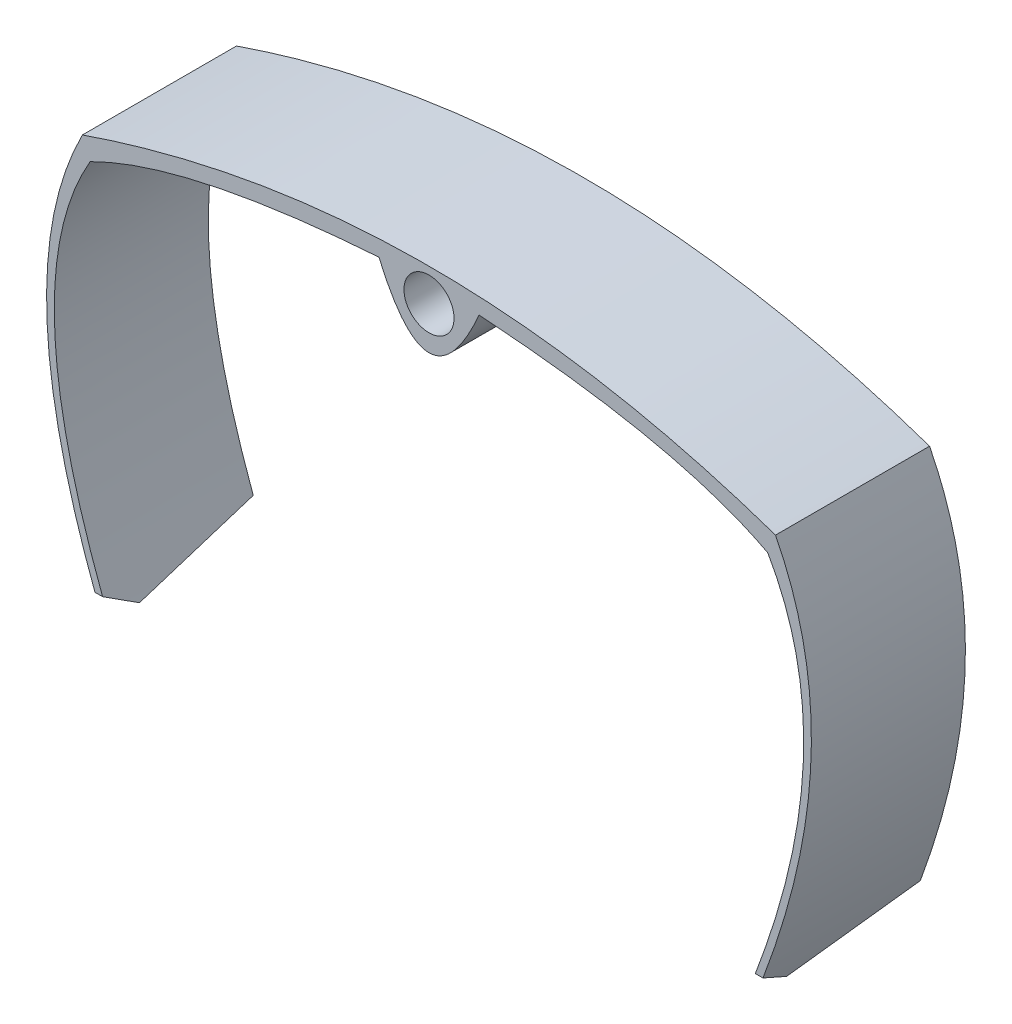
ISO-10303-21;
HEADER;
FILE_DESCRIPTION(('STEP AP214'),'2;1');
FILE_NAME('part.step','',(''),(''),'','','');
FILE_SCHEMA(('AUTOMOTIVE_DESIGN { 1 0 10303 214 1 1 1 1 }'));
ENDSEC;
DATA;
#1=APPLICATION_CONTEXT('core data for automotive mechanical design processes');
#2=APPLICATION_PROTOCOL_DEFINITION('international standard','automotive_design',2000,#1);
#3=PRODUCT_CONTEXT('',#1,'mechanical');
#4=PRODUCT('Part','Part','',(#3));
#5=PRODUCT_RELATED_PRODUCT_CATEGORY('part','',(#4));
#6=PRODUCT_DEFINITION_FORMATION('','',#4);
#7=PRODUCT_DEFINITION_CONTEXT('part definition',#1,'design');
#8=PRODUCT_DEFINITION('design','',#6,#7);
#9=PRODUCT_DEFINITION_SHAPE('','',#8);
#10=(LENGTH_UNIT() NAMED_UNIT(*) SI_UNIT(.MILLI.,.METRE.));
#11=(NAMED_UNIT(*) PLANE_ANGLE_UNIT() SI_UNIT($,.RADIAN.));
#12=(NAMED_UNIT(*) SI_UNIT($,.STERADIAN.) SOLID_ANGLE_UNIT());
#13=UNCERTAINTY_MEASURE_WITH_UNIT(LENGTH_MEASURE(1.E-05),#10,'distance_accuracy_value','');
#14=(GEOMETRIC_REPRESENTATION_CONTEXT(3) GLOBAL_UNCERTAINTY_ASSIGNED_CONTEXT((#13)) GLOBAL_UNIT_ASSIGNED_CONTEXT((#10,
#11,#12)) REPRESENTATION_CONTEXT('',''));
#15=CARTESIAN_POINT('',(0.,0.,0.));
#16=DIRECTION('',(0.,0.,1.));
#17=DIRECTION('',(1.,0.,0.));
#18=AXIS2_PLACEMENT_3D('',#15,#16,#17);
#19=CARTESIAN_POINT('',(-49.5,-28.375,20.));
#20=DIRECTION('',(0.,0.,-1.));
#21=DIRECTION('',(-1.,0.,0.));
#22=AXIS2_PLACEMENT_3D('',#19,#20,#21);
#23=PLANE('',#22);
#24=CARTESIAN_POINT('',(-45.,-3.5,20.));
#25=CARTESIAN_POINT('',(-56.,-25.,20.));
#26=CARTESIAN_POINT('',(-41.,-60.,20.));
#27=B_SPLINE_CURVE_WITH_KNOTS('',2,(#24,#25,#26),.UNSPECIFIED.,.F.,.F.,(3,3),(0.,1.),.UNSPECIFIED.);
#28=CARTESIAN_POINT('',(-45.,-3.5,20.));
#29=VERTEX_POINT('',#28);
#30=CARTESIAN_POINT('',(-43.3725551343736,-54.1199880788758,20.));
#31=VERTEX_POINT('',#30);
#32=EDGE_CURVE('E251',#29,#31,#27,.T.);
#33=ORIENTED_EDGE('',*,*,#32,.T.);
#34=DIRECTION('',(1.,0.,0.));
#35=VECTOR('',#34,1.);
#36=CARTESIAN_POINT('',(-49.5,-54.1199880788758,20.));
#37=LINE('',#36,#35);
#38=CARTESIAN_POINT('',(-42.3794825890074,-54.1199880857841,19.9999999976195));
#39=VERTEX_POINT('',#38);
#40=EDGE_CURVE('E136',#31,#39,#37,.T.);
#41=ORIENTED_EDGE('',*,*,#40,.T.);
#42=CARTESIAN_POINT('',(-40.,-60.,20.));
#43=CARTESIAN_POINT('',(-55.,-25.,20.));
#44=CARTESIAN_POINT('',(-44.,-6.,20.));
#45=B_SPLINE_CURVE_WITH_KNOTS('',2,(#42,#43,#44),.UNSPECIFIED.,.F.,.F.,(3,3),(0.,1.),.UNSPECIFIED.);
#46=CARTESIAN_POINT('',(-44.,-6.,20.));
#47=VERTEX_POINT('',#46);
#48=EDGE_CURVE('E269',#39,#47,#45,.T.);
#49=ORIENTED_EDGE('',*,*,#48,.T.);
#50=CARTESIAN_POINT('',(-44.,-6.,20.));
#51=CARTESIAN_POINT('',(-31.6079509094557,0.274777247759242,20.));
#52=CARTESIAN_POINT('',(-6.5,2.,20.));
#53=B_SPLINE_CURVE_WITH_KNOTS('',2,(#50,#51,#52),.UNSPECIFIED.,.F.,.F.,(3,3),(0.,1.),.UNSPECIFIED.);
#54=CARTESIAN_POINT('',(-6.5,2.,20.));
#55=VERTEX_POINT('',#54);
#56=EDGE_CURVE('E278',#47,#55,#53,.T.);
#57=ORIENTED_EDGE('',*,*,#56,.T.);
#58=CARTESIAN_POINT('',(-6.5,2.,20.));
#59=CARTESIAN_POINT('',(0.,-13.,20.));
#60=CARTESIAN_POINT('',(6.5,2.,20.));
#61=B_SPLINE_CURVE_WITH_KNOTS('',2,(#58,#59,#60),.UNSPECIFIED.,.F.,.F.,(3,3),(0.,1.),.UNSPECIFIED.);
#62=CARTESIAN_POINT('',(6.5,2.,20.));
#63=VERTEX_POINT('',#62);
#64=EDGE_CURVE('E312',#55,#63,#61,.T.);
#65=ORIENTED_EDGE('',*,*,#64,.T.);
#66=CARTESIAN_POINT('',(6.5,2.,20.));
#67=CARTESIAN_POINT('',(32.2286710129802,0.274777247759242,20.));
#68=CARTESIAN_POINT('',(44.,-6.,20.));
#69=B_SPLINE_CURVE_WITH_KNOTS('',2,(#66,#67,#68),.UNSPECIFIED.,.F.,.F.,(3,3),(0.,1.),.UNSPECIFIED.);
#70=CARTESIAN_POINT('',(44.,-6.,20.));
#71=VERTEX_POINT('',#70);
#72=EDGE_CURVE('E212',#63,#71,#69,.T.);
#73=ORIENTED_EDGE('',*,*,#72,.T.);
#74=CARTESIAN_POINT('',(44.,-6.,20.));
#75=CARTESIAN_POINT('',(55.,-25.,20.));
#76=CARTESIAN_POINT('',(40.,-60.,20.));
#77=B_SPLINE_CURVE_WITH_KNOTS('',2,(#74,#75,#76),.UNSPECIFIED.,.F.,.F.,(3,3),(0.,1.),.UNSPECIFIED.);
#78=CARTESIAN_POINT('',(42.3794825895538,-54.1199880788758,20.));
#79=VERTEX_POINT('',#78);
#80=EDGE_CURVE('E206',#71,#79,#77,.T.);
#81=ORIENTED_EDGE('',*,*,#80,.T.);
#82=CARTESIAN_POINT('',(43.3725551338298,-54.1199880858131,19.9999999976095));
#83=VERTEX_POINT('',#82);
#84=EDGE_CURVE('E152',#79,#83,#37,.T.);
#85=ORIENTED_EDGE('',*,*,#84,.T.);
#86=CARTESIAN_POINT('',(41.,-60.,20.));
#87=CARTESIAN_POINT('',(56.,-25.,20.));
#88=CARTESIAN_POINT('',(45.,-3.5,20.));
#89=B_SPLINE_CURVE_WITH_KNOTS('',2,(#86,#87,#88),.UNSPECIFIED.,.F.,.F.,(3,3),(0.,1.),.UNSPECIFIED.);
#90=CARTESIAN_POINT('',(45.,-3.5,20.));
#91=VERTEX_POINT('',#90);
#92=EDGE_CURVE('E211',#83,#91,#89,.T.);
#93=ORIENTED_EDGE('',*,*,#92,.T.);
#94=CARTESIAN_POINT('',(45.,-3.5,20.));
#95=CARTESIAN_POINT('',(0.,12.,20.));
#96=CARTESIAN_POINT('',(-45.,-3.5,20.));
#97=B_SPLINE_CURVE_WITH_KNOTS('',2,(#94,#95,#96),.UNSPECIFIED.,.F.,.F.,(3,3),(0.,1.),.UNSPECIFIED.);
#98=EDGE_CURVE('E224',#91,#29,#97,.T.);
#99=ORIENTED_EDGE('',*,*,#98,.T.);
#100=EDGE_LOOP('',(#33,#41,#49,#57,#65,#73,#81,#85,#93,#99));
#101=FACE_BOUND('',#100,.T.);
#102=CARTESIAN_POINT('',(0.,0.,20.));
#103=DIRECTION('',(0.,0.,1.));
#104=DIRECTION('',(1.,0.,0.));
#105=AXIS2_PLACEMENT_3D('',#102,#103,#104);
#106=CIRCLE('',#105,3.25);
#107=CARTESIAN_POINT('',(3.25,0.,20.));
#108=VERTEX_POINT('',#107);
#109=EDGE_CURVE('E254',#108,#108,#106,.T.);
#110=ORIENTED_EDGE('',*,*,#109,.F.);
#111=EDGE_LOOP('',(#110));
#112=FACE_BOUND('',#111,.T.);
#113=ADVANCED_FACE('F33',(#101,#112),#23,.F.);
#114=CARTESIAN_POINT('',(-49.5,-28.375,0.));
#115=DIRECTION('',(0.,0.,-1.));
#116=DIRECTION('',(-1.,0.,0.));
#117=AXIS2_PLACEMENT_3D('',#114,#115,#116);
#118=PLANE('',#117);
#119=DIRECTION('',(1.,0.,0.));
#120=VECTOR('',#119,1.);
#121=CARTESIAN_POINT('',(-49.5,-52.9458802962909,0.));
#122=LINE('',#121,#120);
#123=CARTESIAN_POINT('',(-43.8095242499858,-52.9458802962909,0.));
#124=VERTEX_POINT('',#123);
#125=CARTESIAN_POINT('',(-42.8192871205812,-52.9458802961712,0.));
#126=VERTEX_POINT('',#125);
#127=EDGE_CURVE('E56',#124,#126,#122,.T.);
#128=ORIENTED_EDGE('',*,*,#127,.F.);
#129=CARTESIAN_POINT('',(-45.,-3.5,0.));
#130=CARTESIAN_POINT('',(-56.,-25.,0.));
#131=CARTESIAN_POINT('',(-41.,-60.,0.));
#132=B_SPLINE_CURVE_WITH_KNOTS('',2,(#129,#130,#131),.UNSPECIFIED.,.F.,.F.,(3,3),(0.,1.),.UNSPECIFIED.);
#133=CARTESIAN_POINT('',(-45.,-3.5,0.));
#134=VERTEX_POINT('',#133);
#135=EDGE_CURVE('E151',#134,#124,#132,.T.);
#136=ORIENTED_EDGE('',*,*,#135,.F.);
#137=CARTESIAN_POINT('',(45.,-3.5,0.));
#138=CARTESIAN_POINT('',(0.,12.,0.));
#139=CARTESIAN_POINT('',(-45.,-3.5,0.));
#140=B_SPLINE_CURVE_WITH_KNOTS('',2,(#137,#138,#139),.UNSPECIFIED.,.F.,.F.,(3,3),(0.,1.),.UNSPECIFIED.);
#141=CARTESIAN_POINT('',(45.,-3.5,0.));
#142=VERTEX_POINT('',#141);
#143=EDGE_CURVE('E270',#142,#134,#140,.T.);
#144=ORIENTED_EDGE('',*,*,#143,.F.);
#145=CARTESIAN_POINT('',(41.,-60.,0.));
#146=CARTESIAN_POINT('',(56.,-25.,0.));
#147=CARTESIAN_POINT('',(45.,-3.5,0.));
#148=B_SPLINE_CURVE_WITH_KNOTS('',2,(#145,#146,#147),.UNSPECIFIED.,.F.,.F.,(3,3),(0.,1.),.UNSPECIFIED.);
#149=CARTESIAN_POINT('',(43.8095242514418,-52.9458803020215,0.));
#150=VERTEX_POINT('',#149);
#151=EDGE_CURVE('E339',#150,#142,#148,.T.);
#152=ORIENTED_EDGE('',*,*,#151,.F.);
#153=CARTESIAN_POINT('',(42.819287120613,-52.9458802962909,0.));
#154=VERTEX_POINT('',#153);
#155=EDGE_CURVE('E64',#154,#150,#122,.T.);
#156=ORIENTED_EDGE('',*,*,#155,.F.);
#157=CARTESIAN_POINT('',(44.,-6.,0.));
#158=CARTESIAN_POINT('',(55.,-25.,0.));
#159=CARTESIAN_POINT('',(40.,-60.,0.));
#160=B_SPLINE_CURVE_WITH_KNOTS('',2,(#157,#158,#159),.UNSPECIFIED.,.F.,.F.,(3,3),(0.,1.),.UNSPECIFIED.);
#161=CARTESIAN_POINT('',(44.,-6.,0.));
#162=VERTEX_POINT('',#161);
#163=EDGE_CURVE('E342',#162,#154,#160,.T.);
#164=ORIENTED_EDGE('',*,*,#163,.F.);
#165=CARTESIAN_POINT('',(6.5,2.,0.));
#166=CARTESIAN_POINT('',(32.2286710129802,0.274777247759242,0.));
#167=CARTESIAN_POINT('',(44.,-6.,0.));
#168=B_SPLINE_CURVE_WITH_KNOTS('',2,(#165,#166,#167),.UNSPECIFIED.,.F.,.F.,(3,3),(0.,1.),.UNSPECIFIED.);
#169=CARTESIAN_POINT('',(6.5,2.,0.));
#170=VERTEX_POINT('',#169);
#171=EDGE_CURVE('E318',#170,#162,#168,.T.);
#172=ORIENTED_EDGE('',*,*,#171,.F.);
#173=CARTESIAN_POINT('',(-6.5,2.,0.));
#174=CARTESIAN_POINT('',(0.,-13.,0.));
#175=CARTESIAN_POINT('',(6.5,2.,0.));
#176=B_SPLINE_CURVE_WITH_KNOTS('',2,(#173,#174,#175),.UNSPECIFIED.,.F.,.F.,(3,3),(0.,1.),.UNSPECIFIED.);
#177=CARTESIAN_POINT('',(-6.5,2.,0.));
#178=VERTEX_POINT('',#177);
#179=EDGE_CURVE('E364',#178,#170,#176,.T.);
#180=ORIENTED_EDGE('',*,*,#179,.F.);
#181=CARTESIAN_POINT('',(-44.,-6.,0.));
#182=CARTESIAN_POINT('',(-31.6079509094557,0.274777247759242,0.));
#183=CARTESIAN_POINT('',(-6.5,2.,0.));
#184=B_SPLINE_CURVE_WITH_KNOTS('',2,(#181,#182,#183),.UNSPECIFIED.,.F.,.F.,(3,3),(0.,1.),.UNSPECIFIED.);
#185=CARTESIAN_POINT('',(-44.,-6.,0.));
#186=VERTEX_POINT('',#185);
#187=EDGE_CURVE('E363',#186,#178,#184,.T.);
#188=ORIENTED_EDGE('',*,*,#187,.F.);
#189=CARTESIAN_POINT('',(-40.,-60.,0.));
#190=CARTESIAN_POINT('',(-55.,-25.,0.));
#191=CARTESIAN_POINT('',(-44.,-6.,0.));
#192=B_SPLINE_CURVE_WITH_KNOTS('',2,(#189,#190,#191),.UNSPECIFIED.,.F.,.F.,(3,3),(0.,1.),.UNSPECIFIED.);
#193=EDGE_CURVE('E257',#126,#186,#192,.T.);
#194=ORIENTED_EDGE('',*,*,#193,.F.);
#195=EDGE_LOOP('',(#128,#136,#144,#152,#156,#164,#172,#180,#188,#194));
#196=FACE_BOUND('',#195,.T.);
#197=CARTESIAN_POINT('',(0.,0.,0.));
#198=DIRECTION('',(0.,0.,1.));
#199=DIRECTION('',(1.,0.,0.));
#200=AXIS2_PLACEMENT_3D('',#197,#198,#199);
#201=CIRCLE('',#200,3.25);
#202=CARTESIAN_POINT('',(3.25,0.,0.));
#203=VERTEX_POINT('',#202);
#204=EDGE_CURVE('E141',#203,#203,#201,.T.);
#205=ORIENTED_EDGE('',*,*,#204,.T.);
#206=EDGE_LOOP('',(#205));
#207=FACE_BOUND('',#206,.T.);
#208=ADVANCED_FACE('F243',(#196,#207),#118,.T.);
#209=DIRECTION('',(0.,0.,-1.));
#210=VECTOR('',#209,1.);
#211=SURFACE_OF_LINEAR_EXTRUSION('',#27,#210);
#212=CARTESIAN_POINT('',(-43.8095242499074,-52.9458803014588,9.99641291632411E-10));
#213=CARTESIAN_POINT('',(-43.7405387966916,-53.1339845054756,0.893216633095755));
#214=CARTESIAN_POINT('',(-43.6710617853799,-53.3220810534,1.78639690118482));
#215=CARTESIAN_POINT('',(-43.5311348473555,-53.6982583665723,3.57268248515687));
#216=CARTESIAN_POINT('',(-43.4606849227849,-53.8863391318539,4.46578780120052));
#217=CARTESIAN_POINT('',(-43.3188221315729,-54.2624850349748,6.25192422816345));
#218=CARTESIAN_POINT('',(-43.247409265968,-54.4505501728306,7.14495533916158));
#219=CARTESIAN_POINT('',(-43.1036303511905,-54.8266649689923,8.93094405564118));
#220=CARTESIAN_POINT('',(-43.0312643020459,-55.0147146272986,9.82390166112483));
#221=CARTESIAN_POINT('',(-42.8855886297336,-55.3907986313318,11.609744160139));
#222=CARTESIAN_POINT('',(-42.8122790055225,-55.5788329770415,12.5026290535881));
#223=CARTESIAN_POINT('',(-42.6647255908599,-55.9548865129671,14.2883268743174));
#224=CARTESIAN_POINT('',(-42.590481798387,-56.1429057031494,15.1811398014378));
#225=CARTESIAN_POINT('',(-42.5157757451419,-56.3309170911311,16.0739156795812));
#226=B_SPLINE_CURVE_WITH_KNOTS('',3,(#212,#213,#214,#215,#216,#217,#218,#219,#220,#221,#222,
#223,#224,#225),.UNSPECIFIED.,.F.,.F.,(4,2,2,2,2,2,4),(0.,2.74623422202778,5.49246239872015,
8.23868761956475,10.9849127592141,13.7311409359048,16.4773750564232),.UNSPECIFIED.);
#227=CARTESIAN_POINT('',(-42.5157757451419,-56.3309170911311,16.0739156795812));
#228=VERTEX_POINT('',#227);
#229=EDGE_CURVE('E144',#124,#228,#226,.T.);
#230=ORIENTED_EDGE('',*,*,#229,.T.);
#231=CARTESIAN_POINT('',(-42.5157757451419,-56.3309170911311,16.0739156795812));
#232=CARTESIAN_POINT('',(-42.6620900863464,-55.9627571434735,16.7276802237581));
#233=CARTESIAN_POINT('',(-42.8066455395971,-55.5944330855392,17.3817361887725));
#234=CARTESIAN_POINT('',(-43.0922386701909,-54.8574567491169,18.6904309604766));
#235=CARTESIAN_POINT('',(-43.2332763475341,-54.4888044706289,19.3450697671662));
#236=CARTESIAN_POINT('',(-43.3725551369235,-54.1199880818642,19.9999999946934));
#237=B_SPLINE_CURVE_WITH_KNOTS('',3,(#231,#232,#233,#234,#235,#236),.UNSPECIFIED.,.F.,.F.,(4,2,
4),(0.,2.29327993598656,4.58655987197313),.UNSPECIFIED.);
#238=EDGE_CURVE('E130',#228,#31,#237,.T.);
#239=ORIENTED_EDGE('',*,*,#238,.T.);
#240=ORIENTED_EDGE('',*,*,#32,.F.);
#241=DIRECTION('',(0.,0.,-1.));
#242=VECTOR('',#241,1.);
#243=CARTESIAN_POINT('',(-45.,-3.5,20.));
#244=LINE('',#243,#242);
#245=EDGE_CURVE('E232',#29,#134,#244,.T.);
#246=ORIENTED_EDGE('',*,*,#245,.T.);
#247=ORIENTED_EDGE('',*,*,#135,.T.);
#248=EDGE_LOOP('',(#230,#239,#240,#246,#247));
#249=FACE_BOUND('',#248,.T.);
#250=ADVANCED_FACE('F35',(#249),#211,.F.);
#251=DIRECTION('',(0.,0.,-1.));
#252=VECTOR('',#251,1.);
#253=SURFACE_OF_LINEAR_EXTRUSION('',#45,#252);
#254=ORIENTED_EDGE('',*,*,#48,.F.);
#255=CARTESIAN_POINT('',(-42.3794825890074,-54.1199880857841,19.9999999976195));
#256=CARTESIAN_POINT('',(-42.2393798303013,-54.4887933555504,19.3450895098468));
#257=CARTESIAN_POINT('',(-42.0975859118973,-54.8574400742124,18.6904605727905));
#258=CARTESIAN_POINT('',(-41.8106157556936,-55.5944164093281,17.3817658001111));
#259=CARTESIAN_POINT('',(-41.665439517894,-55.9627460257817,16.7276999644879));
#260=CARTESIAN_POINT('',(-41.5185721203965,-56.3309170911311,16.0739156795812));
#261=B_SPLINE_CURVE_WITH_KNOTS('',3,(#255,#256,#257,#258,#259,#260),.UNSPECIFIED.,.F.,.F.,(4,2,
4),(0.,2.29366620792392,4.58733241584784),.UNSPECIFIED.);
#262=CARTESIAN_POINT('',(-41.5185721203965,-56.3309170911311,16.0739156795812));
#263=VERTEX_POINT('',#262);
#264=EDGE_CURVE('E292',#39,#263,#261,.T.);
#265=ORIENTED_EDGE('',*,*,#264,.T.);
#266=CARTESIAN_POINT('',(-41.5185721203965,-56.3309170911311,16.0739156795812));
#267=CARTESIAN_POINT('',(-41.5935572832451,-56.1429041685819,15.1811325144666));
#268=CARTESIAN_POINT('',(-41.6680995493056,-55.9548837424875,14.2883137186156));
#269=CARTESIAN_POINT('',(-41.8162873031857,-55.5788282639055,12.5026066731896));
#270=CARTESIAN_POINT('',(-41.8899327928048,-55.3907932114479,11.6097184237575));
#271=CARTESIAN_POINT('',(-42.0363162348552,-55.0147082997665,9.82387161466394));
#272=CARTESIAN_POINT('',(-42.1090541882208,-54.8266584405581,8.9309130550758));
#273=CARTESIAN_POINT('',(-42.2536115225651,-54.450543722937,7.14492471187478));
#274=CARTESIAN_POINT('',(-42.3254309035136,-54.2624788645238,6.25189492825958));
#275=CARTESIAN_POINT('',(-42.4681398549805,-53.8863339773263,4.4657633242149));
#276=CARTESIAN_POINT('',(-42.5390294245719,-53.6982539485271,3.57266150371449));
#277=CARTESIAN_POINT('',(-42.6798672202379,-53.3220785375241,1.78638495676229));
#278=CARTESIAN_POINT('',(-42.7498154443843,-53.1339831552898,0.893210230164924));
#279=CARTESIAN_POINT('',(-42.8192871205406,-52.9458802962809,-4.75626482643321E-11));
#280=B_SPLINE_CURVE_WITH_KNOTS('',3,(#266,#267,#268,#269,#270,#271,#272,#273,#274,#275,#276,
#277,#278,#279),.UNSPECIFIED.,.F.,.F.,(4,2,2,2,2,2,4),(0.,2.74632485758067,5.4926442031035,
8.23896072057649,10.9852773280662,13.7315966735918,16.4779216437163),.UNSPECIFIED.);
#281=EDGE_CURVE('E145',#263,#126,#280,.T.);
#282=ORIENTED_EDGE('',*,*,#281,.T.);
#283=ORIENTED_EDGE('',*,*,#193,.T.);
#284=DIRECTION('',(0.,0.,-1.));
#285=VECTOR('',#284,1.);
#286=CARTESIAN_POINT('',(-44.,-6.,20.));
#287=LINE('',#286,#285);
#288=EDGE_CURVE('E330',#47,#186,#287,.T.);
#289=ORIENTED_EDGE('',*,*,#288,.F.);
#290=EDGE_LOOP('',(#254,#265,#282,#283,#289));
#291=FACE_BOUND('',#290,.T.);
#292=ADVANCED_FACE('F285',(#291),#253,.F.);
#293=DIRECTION('',(0.,0.,-1.));
#294=VECTOR('',#293,1.);
#295=SURFACE_OF_LINEAR_EXTRUSION('',#53,#294);
#296=ORIENTED_EDGE('',*,*,#187,.T.);
#297=DIRECTION('',(0.,0.,-1.));
#298=VECTOR('',#297,1.);
#299=CARTESIAN_POINT('',(-6.5,2.,20.));
#300=LINE('',#299,#298);
#301=EDGE_CURVE('E323',#55,#178,#300,.T.);
#302=ORIENTED_EDGE('',*,*,#301,.F.);
#303=ORIENTED_EDGE('',*,*,#56,.F.);
#304=ORIENTED_EDGE('',*,*,#288,.T.);
#305=EDGE_LOOP('',(#296,#302,#303,#304));
#306=FACE_BOUND('',#305,.T.);
#307=ADVANCED_FACE('F289',(#306),#295,.F.);
#308=DIRECTION('',(0.,0.,-1.));
#309=VECTOR('',#308,1.);
#310=SURFACE_OF_LINEAR_EXTRUSION('',#61,#309);
#311=ORIENTED_EDGE('',*,*,#179,.T.);
#312=DIRECTION('',(0.,0.,-1.));
#313=VECTOR('',#312,1.);
#314=CARTESIAN_POINT('',(6.5,2.,20.));
#315=LINE('',#314,#313);
#316=EDGE_CURVE('E320',#63,#170,#315,.T.);
#317=ORIENTED_EDGE('',*,*,#316,.F.);
#318=ORIENTED_EDGE('',*,*,#64,.F.);
#319=ORIENTED_EDGE('',*,*,#301,.T.);
#320=EDGE_LOOP('',(#311,#317,#318,#319));
#321=FACE_BOUND('',#320,.T.);
#322=ADVANCED_FACE('F388',(#321),#310,.F.);
#323=DIRECTION('',(0.,0.,-1.));
#324=VECTOR('',#323,1.);
#325=SURFACE_OF_LINEAR_EXTRUSION('',#69,#324);
#326=ORIENTED_EDGE('',*,*,#171,.T.);
#327=DIRECTION('',(0.,0.,-1.));
#328=VECTOR('',#327,1.);
#329=CARTESIAN_POINT('',(44.,-6.,20.));
#330=LINE('',#329,#328);
#331=EDGE_CURVE('E316',#71,#162,#330,.T.);
#332=ORIENTED_EDGE('',*,*,#331,.F.);
#333=ORIENTED_EDGE('',*,*,#72,.F.);
#334=ORIENTED_EDGE('',*,*,#316,.T.);
#335=EDGE_LOOP('',(#326,#332,#333,#334));
#336=FACE_BOUND('',#335,.T.);
#337=ADVANCED_FACE('F198',(#336),#325,.F.);
#338=DIRECTION('',(0.,0.,-1.));
#339=VECTOR('',#338,1.);
#340=SURFACE_OF_LINEAR_EXTRUSION('',#77,#339);
#341=CARTESIAN_POINT('',(42.8192871206134,-52.9458802961831,-2.08588776046657E-11));
#342=CARTESIAN_POINT('',(42.7498154444104,-53.1339831552547,0.893210230174727));
#343=CARTESIAN_POINT('',(42.6798672202449,-53.3220785375147,1.78638495676513));
#344=CARTESIAN_POINT('',(42.5390294245649,-53.6982539485365,3.57266150371221));
#345=CARTESIAN_POINT('',(42.4681398549787,-53.8863339773289,4.46576332421445));
#346=CARTESIAN_POINT('',(42.3254309035155,-54.2624788645213,6.25189492826045));
#347=CARTESIAN_POINT('',(42.2536115225656,-54.4505437229363,7.14492471187515));
#348=CARTESIAN_POINT('',(42.1090541882203,-54.8266584405588,8.93091305507577));
#349=CARTESIAN_POINT('',(42.036316234855,-55.0147082997667,9.82387161466403));
#350=CARTESIAN_POINT('',(41.889932792805,-55.3907932114477,11.6097184237577));
#351=CARTESIAN_POINT('',(41.8162873031857,-55.5788282639054,12.5026066731897));
#352=CARTESIAN_POINT('',(41.6680995493055,-55.9548837424876,14.2883137186156));
#353=CARTESIAN_POINT('',(41.593557283245,-56.1429041685821,15.1811325144666));
#354=CARTESIAN_POINT('',(41.5185721203965,-56.3309170911311,16.0739156795812));
#355=B_SPLINE_CURVE_WITH_KNOTS('',3,(#341,#342,#343,#344,#345,#346,#347,#348,#349,#350,#351,
#352,#353,#354),.UNSPECIFIED.,.F.,.F.,(4,2,2,2,2,2,4),(0.,2.74632497012441,5.49264431564994,
8.23896092313962,10.9852774406126,13.7315967861354,16.4779216437159),.UNSPECIFIED.);
#356=CARTESIAN_POINT('',(41.5185721203965,-56.3309170911311,16.0739156795812));
#357=VERTEX_POINT('',#356);
#358=EDGE_CURVE('E185',#154,#357,#355,.T.);
#359=ORIENTED_EDGE('',*,*,#358,.T.);
#360=CARTESIAN_POINT('',(41.5185721203965,-56.3309170911311,16.0739156795812));
#361=CARTESIAN_POINT('',(41.6654395173763,-55.96274602644,16.7276999649667));
#362=CARTESIAN_POINT('',(41.8106157551753,-55.5944164099881,17.3817658005868));
#363=CARTESIAN_POINT('',(42.0975859124116,-54.8574400735626,18.6904605722967));
#364=CARTESIAN_POINT('',(42.2393798318489,-54.4887933535889,19.3450895083863));
#365=CARTESIAN_POINT('',(42.3794825921054,-54.1199880818544,19.9999999947107));
#366=B_SPLINE_CURVE_WITH_KNOTS('',3,(#360,#361,#362,#363,#364,#365),.UNSPECIFIED.,.F.,.F.,(4,2,
4),(0.,2.29366620791332,4.58733241582664),.UNSPECIFIED.);
#367=EDGE_CURVE('E155',#357,#79,#366,.T.);
#368=ORIENTED_EDGE('',*,*,#367,.T.);
#369=ORIENTED_EDGE('',*,*,#80,.F.);
#370=ORIENTED_EDGE('',*,*,#331,.T.);
#371=ORIENTED_EDGE('',*,*,#163,.T.);
#372=EDGE_LOOP('',(#359,#368,#369,#370,#371));
#373=FACE_BOUND('',#372,.T.);
#374=ADVANCED_FACE('F192',(#373),#340,.F.);
#375=DIRECTION('',(0.,0.,-1.));
#376=VECTOR('',#375,1.);
#377=SURFACE_OF_LINEAR_EXTRUSION('',#89,#376);
#378=ORIENTED_EDGE('',*,*,#92,.F.);
#379=CARTESIAN_POINT('',(43.3725551338298,-54.1199880858131,19.9999999976095));
#380=CARTESIAN_POINT('',(43.2332763459886,-54.4888044725999,19.3450697686305));
#381=CARTESIAN_POINT('',(43.0922386696774,-54.8574567497697,18.690430960972));
#382=CARTESIAN_POINT('',(42.8066455401148,-55.5944330848757,17.3817361882959));
#383=CARTESIAN_POINT('',(42.6620900868634,-55.9627571428118,16.7276802232783));
#384=CARTESIAN_POINT('',(42.5157757451419,-56.3309170911311,16.0739156795812));
#385=B_SPLINE_CURVE_WITH_KNOTS('',3,(#379,#380,#381,#382,#383,#384),.UNSPECIFIED.,.F.,.F.,(4,2,
4),(0.,2.29327993599759,4.58655987199518),.UNSPECIFIED.);
#386=CARTESIAN_POINT('',(42.5157757451419,-56.3309170911311,16.0739156795812));
#387=VERTEX_POINT('',#386);
#388=EDGE_CURVE('E11',#83,#387,#385,.T.);
#389=ORIENTED_EDGE('',*,*,#388,.T.);
#390=CARTESIAN_POINT('',(42.5157757451419,-56.3309170911311,16.0739156795812));
#391=CARTESIAN_POINT('',(42.59048179838,-56.1429057031589,15.1811398014366));
#392=CARTESIAN_POINT('',(42.6647255908563,-55.9548865129723,14.2883268743187));
#393=CARTESIAN_POINT('',(42.8122790055255,-55.5788329770378,12.502629053594));
#394=CARTESIAN_POINT('',(42.8855886297401,-55.3907986313236,11.6097441601471));
#395=CARTESIAN_POINT('',(43.0312643020385,-55.0147146273094,9.82390166112927));
#396=CARTESIAN_POINT('',(43.1036303511658,-54.8266649690265,8.93094405563987));
#397=CARTESIAN_POINT('',(43.2474092659914,-54.4505501727999,7.1449553391791));
#398=CARTESIAN_POINT('',(43.3188221316614,-54.2624850348558,6.25192422820557));
#399=CARTESIAN_POINT('',(43.4606849226947,-53.8863391319773,4.46578780117953));
#400=CARTESIAN_POINT('',(43.5311348470214,-53.6982583670264,3.57268248504819));
#401=CARTESIAN_POINT('',(43.6710617857118,-53.3220810529517,1.78639690132111));
#402=CARTESIAN_POINT('',(43.7405387979335,-53.133984503794,0.893216633564701));
#403=CARTESIAN_POINT('',(43.8095242533677,-52.9458802967703,2.2765400675695E-09));
#404=B_SPLINE_CURVE_WITH_KNOTS('',3,(#390,#391,#392,#393,#394,#395,#396,#397,#398,#399,#400,
#401,#402,#403),.UNSPECIFIED.,.F.,.F.,(4,2,2,2,2,2,4),(0.,2.74623412051457,5.49246229720248,
8.23868743685037,10.9849126576923,13.7311408343819,16.4773750564033),.UNSPECIFIED.);
#405=EDGE_CURVE('E49',#387,#150,#404,.T.);
#406=ORIENTED_EDGE('',*,*,#405,.T.);
#407=ORIENTED_EDGE('',*,*,#151,.T.);
#408=DIRECTION('',(0.,0.,-1.));
#409=VECTOR('',#408,1.);
#410=CARTESIAN_POINT('',(45.,-3.5,20.));
#411=LINE('',#410,#409);
#412=EDGE_CURVE('E321',#91,#142,#411,.T.);
#413=ORIENTED_EDGE('',*,*,#412,.F.);
#414=EDGE_LOOP('',(#378,#389,#406,#407,#413));
#415=FACE_BOUND('',#414,.T.);
#416=ADVANCED_FACE('F197',(#415),#377,.F.);
#417=DIRECTION('',(0.,0.,-1.));
#418=VECTOR('',#417,1.);
#419=SURFACE_OF_LINEAR_EXTRUSION('',#97,#418);
#420=ORIENTED_EDGE('',*,*,#143,.T.);
#421=ORIENTED_EDGE('',*,*,#245,.F.);
#422=ORIENTED_EDGE('',*,*,#98,.F.);
#423=ORIENTED_EDGE('',*,*,#412,.T.);
#424=EDGE_LOOP('',(#420,#421,#422,#423));
#425=FACE_BOUND('',#424,.T.);
#426=ADVANCED_FACE('F239',(#425),#419,.F.);
#427=CARTESIAN_POINT('',(0.,0.,20.));
#428=DIRECTION('',(0.,0.,-1.));
#429=DIRECTION('',(-1.,0.,0.));
#430=AXIS2_PLACEMENT_3D('',#427,#428,#429);
#431=CYLINDRICAL_SURFACE('',#430,3.25);
#432=ORIENTED_EDGE('',*,*,#109,.T.);
#433=EDGE_LOOP('',(#432));
#434=FACE_BOUND('',#433,.T.);
#435=ORIENTED_EDGE('',*,*,#204,.F.);
#436=EDGE_LOOP('',(#435));
#437=FACE_BOUND('',#436,.T.);
#438=ADVANCED_FACE('F175',(#434,#437),#431,.F.);
#439=CARTESIAN_POINT('',(-50.5,-56.3309170911311,16.0739156795812));
#440=DIRECTION('',(0.,0.978536841291867,0.206071954022217));
#441=DIRECTION('',(0.,-0.206071954022217,0.978536841291868));
#442=AXIS2_PLACEMENT_3D('',#439,#440,#441);
#443=PLANE('',#442);
#444=ORIENTED_EDGE('',*,*,#155,.T.);
#445=ORIENTED_EDGE('',*,*,#405,.F.);
#446=DIRECTION('',(1.,0.,0.));
#447=VECTOR('',#446,1.);
#448=CARTESIAN_POINT('',(-50.5,-56.3309170911311,16.0739156795812));
#449=LINE('',#448,#447);
#450=EDGE_CURVE('E146',#357,#387,#449,.T.);
#451=ORIENTED_EDGE('',*,*,#450,.F.);
#452=ORIENTED_EDGE('',*,*,#358,.F.);
#453=EDGE_LOOP('',(#444,#445,#451,#452));
#454=FACE_BOUND('',#453,.T.);
#455=ADVANCED_FACE('F173',(#454),#443,.F.);
#456=CARTESIAN_POINT('',(-50.5,-51.7916626068983,24.1345525241618));
#457=DIRECTION('',(0.,0.871337727985164,-0.490683771679534));
#458=DIRECTION('',(0.,0.490683771679534,0.871337727985164));
#459=AXIS2_PLACEMENT_3D('',#456,#457,#458);
#460=PLANE('',#459);
#461=ORIENTED_EDGE('',*,*,#450,.T.);
#462=ORIENTED_EDGE('',*,*,#388,.F.);
#463=ORIENTED_EDGE('',*,*,#84,.F.);
#464=ORIENTED_EDGE('',*,*,#367,.F.);
#465=EDGE_LOOP('',(#461,#462,#463,#464));
#466=FACE_BOUND('',#465,.T.);
#467=ADVANCED_FACE('F470',(#466),#460,.F.);
#468=EDGE_CURVE('E133',#228,#263,#449,.T.);
#469=ORIENTED_EDGE('',*,*,#468,.T.);
#470=ORIENTED_EDGE('',*,*,#264,.F.);
#471=ORIENTED_EDGE('',*,*,#40,.F.);
#472=ORIENTED_EDGE('',*,*,#238,.F.);
#473=EDGE_LOOP('',(#469,#470,#471,#472));
#474=FACE_BOUND('',#473,.T.);
#475=ADVANCED_FACE('F132',(#474),#460,.F.);
#476=ORIENTED_EDGE('',*,*,#127,.T.);
#477=ORIENTED_EDGE('',*,*,#281,.F.);
#478=ORIENTED_EDGE('',*,*,#468,.F.);
#479=ORIENTED_EDGE('',*,*,#229,.F.);
#480=EDGE_LOOP('',(#476,#477,#478,#479));
#481=FACE_BOUND('',#480,.T.);
#482=ADVANCED_FACE('F143',(#481),#443,.F.);
#483=CLOSED_SHELL('',(#113,#208,#250,#292,#307,#322,#337,#374,#416,#426,#438,#455,#467,#475,#482));
#484=MANIFOLD_SOLID_BREP('B2',#483);
#485=ADVANCED_BREP_SHAPE_REPRESENTATION('',(#18,#484),#14);
#486=SHAPE_DEFINITION_REPRESENTATION(#9,#485);
ENDSEC;
END-ISO-10303-21;
